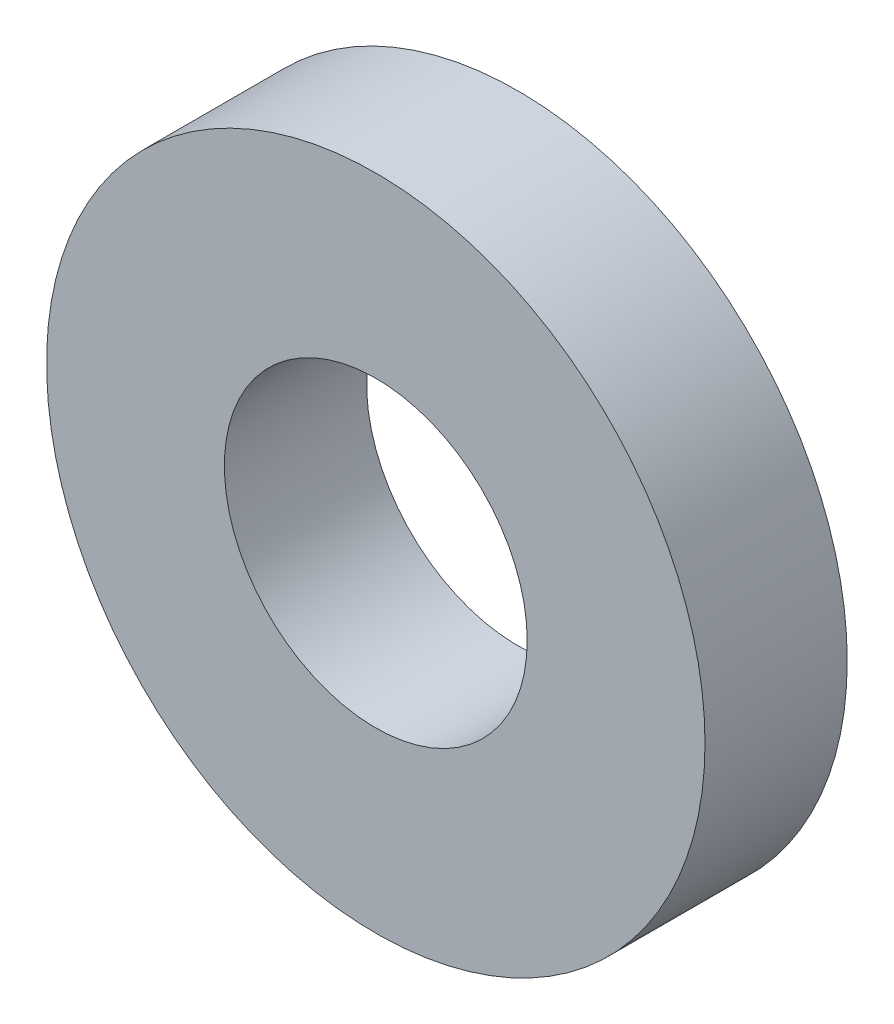
ISO-10303-21;
HEADER;
FILE_DESCRIPTION(('STEP AP214'),'2;1');
FILE_NAME('part.step','',(''),(''),'','','');
FILE_SCHEMA(('AUTOMOTIVE_DESIGN { 1 0 10303 214 1 1 1 1 }'));
ENDSEC;
DATA;
#1=APPLICATION_CONTEXT('core data for automotive mechanical design processes');
#2=APPLICATION_PROTOCOL_DEFINITION('international standard','automotive_design',2000,#1);
#3=PRODUCT_CONTEXT('',#1,'mechanical');
#4=PRODUCT('Part','Part','',(#3));
#5=PRODUCT_RELATED_PRODUCT_CATEGORY('part','',(#4));
#6=PRODUCT_DEFINITION_FORMATION('','',#4);
#7=PRODUCT_DEFINITION_CONTEXT('part definition',#1,'design');
#8=PRODUCT_DEFINITION('design','',#6,#7);
#9=PRODUCT_DEFINITION_SHAPE('','',#8);
#10=(LENGTH_UNIT() NAMED_UNIT(*) SI_UNIT(.MILLI.,.METRE.));
#11=(NAMED_UNIT(*) PLANE_ANGLE_UNIT() SI_UNIT($,.RADIAN.));
#12=(NAMED_UNIT(*) SI_UNIT($,.STERADIAN.) SOLID_ANGLE_UNIT());
#13=UNCERTAINTY_MEASURE_WITH_UNIT(LENGTH_MEASURE(1.E-05),#10,'distance_accuracy_value','');
#14=(GEOMETRIC_REPRESENTATION_CONTEXT(3) GLOBAL_UNCERTAINTY_ASSIGNED_CONTEXT((#13)) GLOBAL_UNIT_ASSIGNED_CONTEXT((#10,
#11,#12)) REPRESENTATION_CONTEXT('',''));
#15=CARTESIAN_POINT('',(0.,0.,0.));
#16=DIRECTION('',(0.,0.,1.));
#17=DIRECTION('',(1.,0.,0.));
#18=AXIS2_PLACEMENT_3D('',#15,#16,#17);
#19=CARTESIAN_POINT('',(0.,0.,-2.7432));
#20=DIRECTION('',(0.,0.,1.));
#21=DIRECTION('',(1.,0.,0.));
#22=AXIS2_PLACEMENT_3D('',#19,#20,#21);
#23=CYLINDRICAL_SURFACE('',#22,6.35);
#24=CARTESIAN_POINT('',(0.,0.,-2.7432));
#25=DIRECTION('',(0.,0.,1.));
#26=DIRECTION('',(1.,0.,0.));
#27=AXIS2_PLACEMENT_3D('',#24,#25,#26);
#28=CIRCLE('',#27,6.35);
#29=CARTESIAN_POINT('',(6.35,0.,-2.7432));
#30=VERTEX_POINT('',#29);
#31=EDGE_CURVE('E10',#30,#30,#28,.T.);
#32=ORIENTED_EDGE('',*,*,#31,.T.);
#33=EDGE_LOOP('',(#32));
#34=FACE_BOUND('',#33,.T.);
#35=CARTESIAN_POINT('',(0.,0.,0.));
#36=DIRECTION('',(0.,0.,1.));
#37=DIRECTION('',(1.,0.,0.));
#38=AXIS2_PLACEMENT_3D('',#35,#36,#37);
#39=CIRCLE('',#38,6.35);
#40=CARTESIAN_POINT('',(6.35,0.,0.));
#41=VERTEX_POINT('',#40);
#42=EDGE_CURVE('E33',#41,#41,#39,.T.);
#43=ORIENTED_EDGE('',*,*,#42,.F.);
#44=EDGE_LOOP('',(#43));
#45=FACE_BOUND('',#44,.T.);
#46=ADVANCED_FACE('F30',(#34,#45),#23,.T.);
#47=CARTESIAN_POINT('',(0.,0.,-2.7432));
#48=DIRECTION('',(0.,0.,1.));
#49=DIRECTION('',(1.,0.,0.));
#50=AXIS2_PLACEMENT_3D('',#47,#48,#49);
#51=PLANE('',#50);
#52=CARTESIAN_POINT('',(0.,0.,-2.7432));
#53=DIRECTION('',(0.,0.,1.));
#54=DIRECTION('',(1.,0.,0.));
#55=AXIS2_PLACEMENT_3D('',#52,#53,#54);
#56=CIRCLE('',#55,2.921);
#57=CARTESIAN_POINT('',(2.921,0.,-2.7432));
#58=VERTEX_POINT('',#57);
#59=EDGE_CURVE('E40',#58,#58,#56,.T.);
#60=ORIENTED_EDGE('',*,*,#59,.T.);
#61=EDGE_LOOP('',(#60));
#62=FACE_BOUND('',#61,.T.);
#63=ORIENTED_EDGE('',*,*,#31,.F.);
#64=EDGE_LOOP('',(#63));
#65=FACE_BOUND('',#64,.T.);
#66=ADVANCED_FACE('F48',(#62,#65),#51,.F.);
#67=CARTESIAN_POINT('',(0.,0.,0.));
#68=DIRECTION('',(0.,0.,1.));
#69=DIRECTION('',(1.,0.,0.));
#70=AXIS2_PLACEMENT_3D('',#67,#68,#69);
#71=PLANE('',#70);
#72=CARTESIAN_POINT('',(0.,0.,0.));
#73=DIRECTION('',(0.,0.,1.));
#74=DIRECTION('',(1.,0.,0.));
#75=AXIS2_PLACEMENT_3D('',#72,#73,#74);
#76=CIRCLE('',#75,2.921);
#77=CARTESIAN_POINT('',(2.921,0.,0.));
#78=VERTEX_POINT('',#77);
#79=EDGE_CURVE('E42',#78,#78,#76,.T.);
#80=ORIENTED_EDGE('',*,*,#79,.F.);
#81=EDGE_LOOP('',(#80));
#82=FACE_BOUND('',#81,.T.);
#83=ORIENTED_EDGE('',*,*,#42,.T.);
#84=EDGE_LOOP('',(#83));
#85=FACE_BOUND('',#84,.T.);
#86=ADVANCED_FACE('F54',(#82,#85),#71,.T.);
#87=CARTESIAN_POINT('',(0.,0.,-2.7432));
#88=DIRECTION('',(0.,0.,1.));
#89=DIRECTION('',(1.,0.,0.));
#90=AXIS2_PLACEMENT_3D('',#87,#88,#89);
#91=CYLINDRICAL_SURFACE('',#90,2.921);
#92=ORIENTED_EDGE('',*,*,#59,.F.);
#93=EDGE_LOOP('',(#92));
#94=FACE_BOUND('',#93,.T.);
#95=ORIENTED_EDGE('',*,*,#79,.T.);
#96=EDGE_LOOP('',(#95));
#97=FACE_BOUND('',#96,.T.);
#98=ADVANCED_FACE('F51',(#94,#97),#91,.F.);
#99=CLOSED_SHELL('',(#46,#66,#86,#98));
#100=MANIFOLD_SOLID_BREP('B2',#99);
#101=ADVANCED_BREP_SHAPE_REPRESENTATION('',(#18,#100),#14);
#102=SHAPE_DEFINITION_REPRESENTATION(#9,#101);
ENDSEC;
END-ISO-10303-21;
